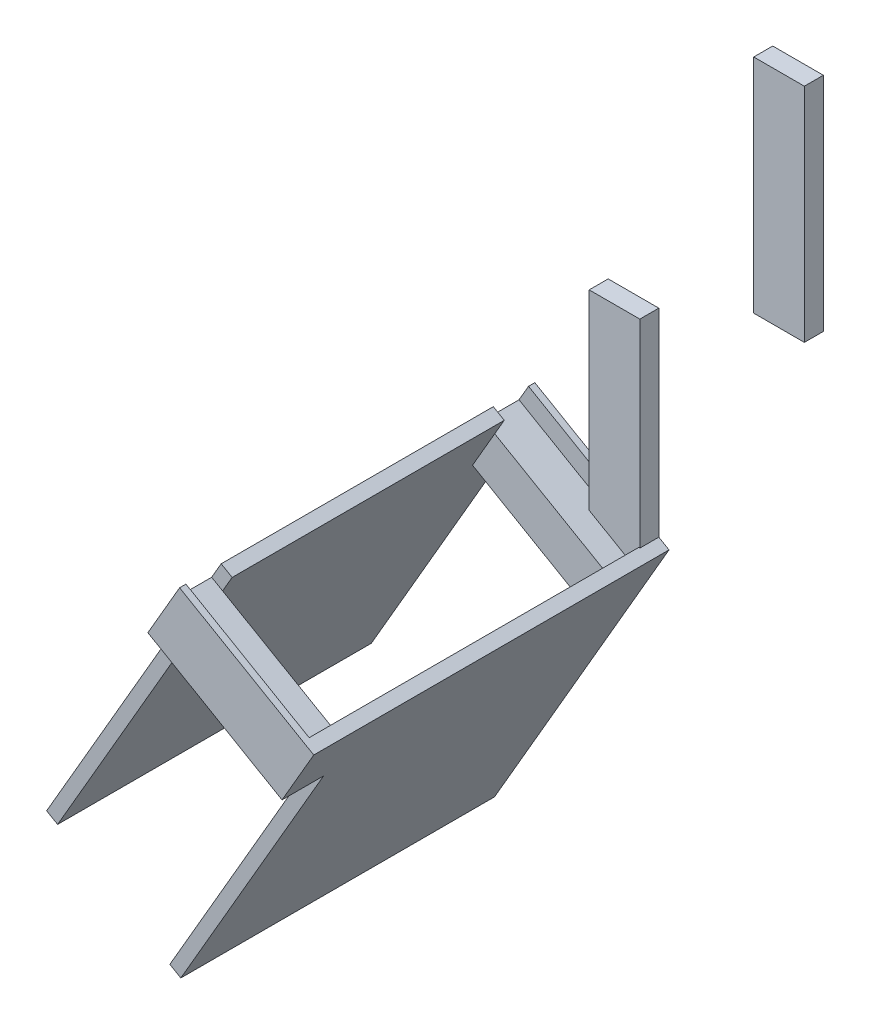
ISO-10303-21;
HEADER;
FILE_DESCRIPTION(('STEP AP214'),'2;1');
FILE_NAME('part.step','',(''),(''),'','','');
FILE_SCHEMA(('AUTOMOTIVE_DESIGN { 1 0 10303 214 1 1 1 1 }'));
ENDSEC;
DATA;
#1=APPLICATION_CONTEXT('core data for automotive mechanical design processes');
#2=APPLICATION_PROTOCOL_DEFINITION('international standard','automotive_design',2000,#1);
#3=PRODUCT_CONTEXT('',#1,'mechanical');
#4=PRODUCT('Part','Part','',(#3));
#5=PRODUCT_RELATED_PRODUCT_CATEGORY('part','',(#4));
#6=PRODUCT_DEFINITION_FORMATION('','',#4);
#7=PRODUCT_DEFINITION_CONTEXT('part definition',#1,'design');
#8=PRODUCT_DEFINITION('design','',#6,#7);
#9=PRODUCT_DEFINITION_SHAPE('','',#8);
#10=(LENGTH_UNIT() NAMED_UNIT(*) SI_UNIT(.MILLI.,.METRE.));
#11=(NAMED_UNIT(*) PLANE_ANGLE_UNIT() SI_UNIT($,.RADIAN.));
#12=(NAMED_UNIT(*) SI_UNIT($,.STERADIAN.) SOLID_ANGLE_UNIT());
#13=UNCERTAINTY_MEASURE_WITH_UNIT(LENGTH_MEASURE(1.E-05),#10,'distance_accuracy_value','');
#14=(GEOMETRIC_REPRESENTATION_CONTEXT(3) GLOBAL_UNCERTAINTY_ASSIGNED_CONTEXT((#13)) GLOBAL_UNIT_ASSIGNED_CONTEXT((#10,
#11,#12)) REPRESENTATION_CONTEXT('',''));
#15=CARTESIAN_POINT('',(0.,0.,0.));
#16=DIRECTION('',(0.,0.,1.));
#17=DIRECTION('',(1.,0.,0.));
#18=AXIS2_PLACEMENT_3D('',#15,#16,#17);
#19=CARTESIAN_POINT('',(34.9862978245216,35.9440867368321,-25.0667994456962));
#20=DIRECTION('',(1.,0.,0.));
#21=DIRECTION('',(0.,0.,-1.));
#22=AXIS2_PLACEMENT_3D('',#19,#20,#21);
#23=PLANE('',#22);
#24=DIRECTION('',(0.,-1.,0.));
#25=VECTOR('',#24,1.);
#26=CARTESIAN_POINT('',(34.9862978245216,35.9440867368321,-28.0667994456962));
#27=LINE('',#26,#25);
#28=CARTESIAN_POINT('',(34.9862978245216,71.0042807635458,-28.0667994456962));
#29=VERTEX_POINT('',#28);
#30=CARTESIAN_POINT('',(34.9862978245216,35.9440867368321,-28.0667994456962));
#31=VERTEX_POINT('',#30);
#32=EDGE_CURVE('E117',#29,#31,#27,.T.);
#33=ORIENTED_EDGE('',*,*,#32,.F.);
#34=DIRECTION('',(0.,0.,-1.));
#35=VECTOR('',#34,1.);
#36=CARTESIAN_POINT('',(34.9862978245216,71.0042807635458,-25.0667994456962));
#37=LINE('',#36,#35);
#38=CARTESIAN_POINT('',(34.9862978245216,71.0042807635458,-25.0667994456962));
#39=VERTEX_POINT('',#38);
#40=EDGE_CURVE('E12',#39,#29,#37,.T.);
#41=ORIENTED_EDGE('',*,*,#40,.F.);
#42=DIRECTION('',(0.,-1.,0.));
#43=VECTOR('',#42,1.);
#44=CARTESIAN_POINT('',(34.9862978245216,35.9440867368321,-25.0667994456962));
#45=LINE('',#44,#43);
#46=CARTESIAN_POINT('',(34.9862978245216,35.9440867368321,-25.0667994456962));
#47=VERTEX_POINT('',#46);
#48=EDGE_CURVE('E111',#39,#47,#45,.T.);
#49=ORIENTED_EDGE('',*,*,#48,.T.);
#50=DIRECTION('',(0.,0.,-1.));
#51=VECTOR('',#50,1.);
#52=CARTESIAN_POINT('',(34.9862978245216,35.9440867368321,-25.0667994456962));
#53=LINE('',#52,#51);
#54=EDGE_CURVE('E56',#47,#31,#53,.T.);
#55=ORIENTED_EDGE('',*,*,#54,.T.);
#56=EDGE_LOOP('',(#33,#41,#49,#55));
#57=FACE_BOUND('',#56,.T.);
#58=ADVANCED_FACE('F53',(#57),#23,.T.);
#59=CARTESIAN_POINT('',(34.9862978245216,71.0042807635458,-25.0667994456962));
#60=DIRECTION('',(0.,1.,0.));
#61=DIRECTION('',(-1.,0.,0.));
#62=AXIS2_PLACEMENT_3D('',#59,#60,#61);
#63=PLANE('',#62);
#64=DIRECTION('',(1.,0.,0.));
#65=VECTOR('',#64,1.);
#66=CARTESIAN_POINT('',(34.9862978245216,71.0042807635458,-28.0667994456962));
#67=LINE('',#66,#65);
#68=CARTESIAN_POINT('',(26.9862978245216,71.004280763546,-28.0667994456962));
#69=VERTEX_POINT('',#68);
#70=EDGE_CURVE('E113',#69,#29,#67,.T.);
#71=ORIENTED_EDGE('',*,*,#70,.F.);
#72=DIRECTION('',(0.,0.,-1.));
#73=VECTOR('',#72,1.);
#74=CARTESIAN_POINT('',(26.9862978245216,71.004280763546,-25.0667994456962));
#75=LINE('',#74,#73);
#76=CARTESIAN_POINT('',(26.9862978245216,71.004280763546,-25.0667994456962));
#77=VERTEX_POINT('',#76);
#78=EDGE_CURVE('E62',#77,#69,#75,.T.);
#79=ORIENTED_EDGE('',*,*,#78,.F.);
#80=DIRECTION('',(1.,0.,0.));
#81=VECTOR('',#80,1.);
#82=CARTESIAN_POINT('',(34.9862978245216,71.0042807635458,-25.0667994456962));
#83=LINE('',#82,#81);
#84=EDGE_CURVE('E108',#77,#39,#83,.T.);
#85=ORIENTED_EDGE('',*,*,#84,.T.);
#86=ORIENTED_EDGE('',*,*,#40,.T.);
#87=EDGE_LOOP('',(#71,#79,#85,#86));
#88=FACE_BOUND('',#87,.T.);
#89=ADVANCED_FACE('F127',(#88),#63,.T.);
#90=CARTESIAN_POINT('',(26.9862978245216,35.9440867368321,-25.0667994456962));
#91=DIRECTION('',(-1.,0.,0.));
#92=DIRECTION('',(0.,0.,1.));
#93=AXIS2_PLACEMENT_3D('',#90,#91,#92);
#94=PLANE('',#93);
#95=DIRECTION('',(0.,1.,0.));
#96=VECTOR('',#95,1.);
#97=CARTESIAN_POINT('',(26.9862978245216,35.9440867368321,-28.0667994456962));
#98=LINE('',#97,#96);
#99=CARTESIAN_POINT('',(26.9862978245216,35.9440867368321,-28.0667994456962));
#100=VERTEX_POINT('',#99);
#101=EDGE_CURVE('E103',#100,#69,#98,.T.);
#102=ORIENTED_EDGE('',*,*,#101,.F.);
#103=DIRECTION('',(0.,0.,-1.));
#104=VECTOR('',#103,1.);
#105=CARTESIAN_POINT('',(26.9862978245216,35.9440867368321,-25.0667994456962));
#106=LINE('',#105,#104);
#107=CARTESIAN_POINT('',(26.9862978245216,35.9440867368321,-25.0667994456962));
#108=VERTEX_POINT('',#107);
#109=EDGE_CURVE('E98',#108,#100,#106,.T.);
#110=ORIENTED_EDGE('',*,*,#109,.F.);
#111=DIRECTION('',(0.,1.,0.));
#112=VECTOR('',#111,1.);
#113=CARTESIAN_POINT('',(26.9862978245216,35.9440867368321,-25.0667994456962));
#114=LINE('',#113,#112);
#115=EDGE_CURVE('E101',#108,#77,#114,.T.);
#116=ORIENTED_EDGE('',*,*,#115,.T.);
#117=ORIENTED_EDGE('',*,*,#78,.T.);
#118=EDGE_LOOP('',(#102,#110,#116,#117));
#119=FACE_BOUND('',#118,.T.);
#120=ADVANCED_FACE('F100',(#119),#94,.T.);
#121=CARTESIAN_POINT('',(34.9862978245216,35.9440867368321,-25.0667994456962));
#122=DIRECTION('',(0.,-1.,0.));
#123=DIRECTION('',(0.,0.,-1.));
#124=AXIS2_PLACEMENT_3D('',#121,#122,#123);
#125=PLANE('',#124);
#126=DIRECTION('',(-1.,0.,0.));
#127=VECTOR('',#126,1.);
#128=CARTESIAN_POINT('',(34.9862978245216,35.9440867368321,-28.0667994456962));
#129=LINE('',#128,#127);
#130=EDGE_CURVE('E120',#31,#100,#129,.T.);
#131=ORIENTED_EDGE('',*,*,#130,.F.);
#132=ORIENTED_EDGE('',*,*,#54,.F.);
#133=DIRECTION('',(-1.,0.,0.));
#134=VECTOR('',#133,1.);
#135=CARTESIAN_POINT('',(34.9862978245216,35.9440867368321,-25.0667994456962));
#136=LINE('',#135,#134);
#137=EDGE_CURVE('E107',#47,#108,#136,.T.);
#138=ORIENTED_EDGE('',*,*,#137,.T.);
#139=ORIENTED_EDGE('',*,*,#109,.T.);
#140=EDGE_LOOP('',(#131,#132,#138,#139));
#141=FACE_BOUND('',#140,.T.);
#142=ADVANCED_FACE('F110',(#141),#125,.T.);
#143=CARTESIAN_POINT('',(0.,0.,-25.0667994456962));
#144=DIRECTION('',(0.,0.,1.));
#145=DIRECTION('',(1.,0.,0.));
#146=AXIS2_PLACEMENT_3D('',#143,#144,#145);
#147=PLANE('',#146);
#148=ORIENTED_EDGE('',*,*,#48,.F.);
#149=ORIENTED_EDGE('',*,*,#84,.F.);
#150=ORIENTED_EDGE('',*,*,#115,.F.);
#151=ORIENTED_EDGE('',*,*,#137,.F.);
#152=EDGE_LOOP('',(#148,#149,#150,#151));
#153=FACE_BOUND('',#152,.T.);
#154=ADVANCED_FACE('F106',(#153),#147,.T.);
#155=CARTESIAN_POINT('',(0.,0.,-28.0667994456962));
#156=DIRECTION('',(0.,0.,1.));
#157=DIRECTION('',(1.,0.,0.));
#158=AXIS2_PLACEMENT_3D('',#155,#156,#157);
#159=PLANE('',#158);
#160=ORIENTED_EDGE('',*,*,#32,.T.);
#161=ORIENTED_EDGE('',*,*,#130,.T.);
#162=ORIENTED_EDGE('',*,*,#101,.T.);
#163=ORIENTED_EDGE('',*,*,#70,.T.);
#164=EDGE_LOOP('',(#160,#161,#162,#163));
#165=FACE_BOUND('',#164,.T.);
#166=ADVANCED_FACE('F126',(#165),#159,.F.);
#167=CLOSED_SHELL('',(#58,#89,#120,#142,#154,#166));
#168=MANIFOLD_SOLID_BREP('B2',#167);
#169=CARTESIAN_POINT('',(0.,0.,0.));
#170=DIRECTION('',(-0.501370217547876,-0.865232861694467,0.));
#171=DIRECTION('',(0.865232861694467,-0.501370217547876,0.));
#172=AXIS2_PLACEMENT_3D('',#169,#170,#171);
#173=PLANE('',#172);
#174=DIRECTION('',(-0.865232861694466,0.501370217547877,0.));
#175=VECTOR('',#174,1.);
#176=CARTESIAN_POINT('',(8.86863683236822,-5.13904472986565,-27.0667994456962));
#177=LINE('',#176,#175);
#178=CARTESIAN_POINT('',(0.986297824521309,-0.57152285441259,-27.0667994456962));
#179=VERTEX_POINT('',#178);
#180=CARTESIAN_POINT('',(-10.5991025557571,6.14178516496151,-27.0667994456962));
#181=VERTEX_POINT('',#180);
#182=EDGE_CURVE('E408',#179,#181,#177,.T.);
#183=ORIENTED_EDGE('',*,*,#182,.F.);
#184=DIRECTION('',(0.,0.,-1.));
#185=VECTOR('',#184,1.);
#186=CARTESIAN_POINT('',(0.986297824521309,-0.571522854412649,0.));
#187=LINE('',#186,#185);
#188=CARTESIAN_POINT('',(0.986297824521309,-0.571522854412743,-28.0667994456962));
#189=VERTEX_POINT('',#188);
#190=EDGE_CURVE('E397',#179,#189,#187,.T.);
#191=ORIENTED_EDGE('',*,*,#190,.T.);
#192=DIRECTION('',(0.865232861694466,-0.501370217547876,0.));
#193=VECTOR('',#192,1.);
#194=CARTESIAN_POINT('',(10.5991025557572,-6.14178516496157,-28.0667994456962));
#195=LINE('',#194,#193);
#196=CARTESIAN_POINT('',(-10.5991025557572,6.14178516496138,-28.0667994456962));
#197=VERTEX_POINT('',#196);
#198=EDGE_CURVE('E557',#197,#189,#195,.T.);
#199=ORIENTED_EDGE('',*,*,#198,.F.);
#200=DIRECTION('',(0.,0.,-1.));
#201=VECTOR('',#200,1.);
#202=CARTESIAN_POINT('',(-10.5991025557572,6.14178516496138,-28.0667994456962));
#203=LINE('',#202,#201);
#204=EDGE_CURVE('E574',#181,#197,#203,.T.);
#205=ORIENTED_EDGE('',*,*,#204,.F.);
#206=EDGE_LOOP('',(#183,#191,#199,#205));
#207=FACE_BOUND('',#206,.T.);
#208=ADVANCED_FACE('F177',(#207),#173,.F.);
#209=DIRECTION('',(0.,0.,-1.));
#210=VECTOR('',#209,1.);
#211=CARTESIAN_POINT('',(-8.86863683236836,5.1390447298657,-21.5000000000001));
#212=LINE('',#211,#210);
#213=CARTESIAN_POINT('',(-8.86863683236849,5.13904472986582,21.5000000000001));
#214=VERTEX_POINT('',#213);
#215=CARTESIAN_POINT('',(-8.86863683236827,5.13904472986578,-21.5000000000001));
#216=VERTEX_POINT('',#215);
#217=EDGE_CURVE('E520',#214,#216,#212,.T.);
#218=ORIENTED_EDGE('',*,*,#217,.T.);
#219=DIRECTION('',(0.865232861694466,-0.501370217547877,0.));
#220=VECTOR('',#219,1.);
#221=CARTESIAN_POINT('',(8.8686368323682,-5.13904472986565,-21.5000000000001));
#222=LINE('',#221,#220);
#223=CARTESIAN_POINT('',(-10.5991025557571,6.1417851649615,-21.5000000000001));
#224=VERTEX_POINT('',#223);
#225=EDGE_CURVE('E415',#224,#216,#222,.T.);
#226=ORIENTED_EDGE('',*,*,#225,.F.);
#227=CARTESIAN_POINT('',(-10.5991025557572,6.14178516496144,21.5000000000001));
#228=VERTEX_POINT('',#227);
#229=EDGE_CURVE('E580',#228,#224,#203,.T.);
#230=ORIENTED_EDGE('',*,*,#229,.F.);
#231=DIRECTION('',(-0.865232861694466,0.501370217547877,0.));
#232=VECTOR('',#231,1.);
#233=CARTESIAN_POINT('',(-848.703286351533,491.791944284619,21.4999999999992));
#234=LINE('',#233,#232);
#235=EDGE_CURVE('E425',#214,#228,#234,.T.);
#236=ORIENTED_EDGE('',*,*,#235,.F.);
#237=EDGE_LOOP('',(#218,#226,#230,#236));
#238=FACE_BOUND('',#237,.T.);
#239=ADVANCED_FACE('F655',(#238),#173,.F.);
#240=CARTESIAN_POINT('',(-13.8823390078471,-3.51328388707882,21.4999999999999));
#241=DIRECTION('',(0.,0.,-1.));
#242=DIRECTION('',(-1.,0.,0.));
#243=AXIS2_PLACEMENT_3D('',#240,#241,#242);
#244=PLANE('',#243);
#245=DIRECTION('',(0.501370217547876,0.865232861694466,0.));
#246=VECTOR('',#245,1.);
#247=CARTESIAN_POINT('',(-13.8823390078471,-3.51328388707882,21.4999999999999));
#248=LINE('',#247,#246);
#249=CARTESIAN_POINT('',(-13.8823390078472,-3.51328388707891,21.4999999999999));
#250=VERTEX_POINT('',#249);
#251=CARTESIAN_POINT('',(-10.372747485012,2.54334614478235,21.5000000000001));
#252=VERTEX_POINT('',#251);
#253=EDGE_CURVE('E536',#250,#252,#248,.T.);
#254=ORIENTED_EDGE('',*,*,#253,.T.);
#255=DIRECTION('',(-0.865232861694466,0.501370217547877,0.));
#256=VECTOR('',#255,1.);
#257=CARTESIAN_POINT('',(-850.207397004177,489.196245699535,21.4999999999992));
#258=LINE('',#257,#256);
#259=CARTESIAN_POINT('',(7.36452617972448,-7.73474331494909,21.5000000000001));
#260=VERTEX_POINT('',#259);
#261=EDGE_CURVE('E432',#260,#252,#258,.T.);
#262=ORIENTED_EDGE('',*,*,#261,.F.);
#263=DIRECTION('',(0.501370217547876,0.865232861694466,0.));
#264=VECTOR('',#263,1.);
#265=CARTESIAN_POINT('',(3.85493465688941,-13.7913733468103,21.5000000000001));
#266=LINE('',#265,#264);
#267=CARTESIAN_POINT('',(3.8549346568894,-13.7913733468103,21.5000000000001));
#268=VERTEX_POINT('',#267);
#269=EDGE_CURVE('E540',#268,#260,#266,.T.);
#270=ORIENTED_EDGE('',*,*,#269,.F.);
#271=DIRECTION('',(-0.865232861694467,0.501370217547876,0.));
#272=VECTOR('',#271,1.);
#273=CARTESIAN_POINT('',(-13.8823390078471,-3.51328388707882,21.4999999999999));
#274=LINE('',#273,#272);
#275=EDGE_CURVE('E525',#268,#250,#274,.T.);
#276=ORIENTED_EDGE('',*,*,#275,.T.);
#277=EDGE_LOOP('',(#254,#262,#270,#276));
#278=FACE_BOUND('',#277,.T.);
#279=ADVANCED_FACE('F682',(#278),#244,.T.);
#280=CARTESIAN_POINT('',(-5.01370217547876,-8.65232861694467,0.));
#281=DIRECTION('',(-0.501370217547876,-0.865232861694467,0.));
#282=DIRECTION('',(0.865232861694467,-0.501370217547876,0.));
#283=AXIS2_PLACEMENT_3D('',#280,#281,#282);
#284=PLANE('',#283);
#285=DIRECTION('',(0.865232861694467,-0.501370217547876,0.));
#286=VECTOR('',#285,1.);
#287=CARTESIAN_POINT('',(-13.8823390078471,-3.51328388707896,-21.5000000000001));
#288=LINE('',#287,#286);
#289=CARTESIAN_POINT('',(-13.8823390078471,-3.51328388707896,-21.5000000000001));
#290=VERTEX_POINT('',#289);
#291=CARTESIAN_POINT('',(3.85493465688943,-13.7913733468103,-21.5));
#292=VERTEX_POINT('',#291);
#293=EDGE_CURVE('E521',#290,#292,#288,.T.);
#294=ORIENTED_EDGE('',*,*,#293,.F.);
#295=DIRECTION('',(0.,0.,1.));
#296=VECTOR('',#295,1.);
#297=CARTESIAN_POINT('',(-13.8823390078471,-3.51328388707885,-28.0667994456962));
#298=LINE('',#297,#296);
#299=CARTESIAN_POINT('',(-13.8823390078471,-3.51328388707885,-28.0667994456962));
#300=VERTEX_POINT('',#299);
#301=EDGE_CURVE('E472',#300,#290,#298,.T.);
#302=ORIENTED_EDGE('',*,*,#301,.F.);
#303=DIRECTION('',(0.865232861694466,-0.501370217547876,0.));
#304=VECTOR('',#303,1.);
#305=CARTESIAN_POINT('',(5.58540038027846,-14.7941137819062,-28.0667994456962));
#306=LINE('',#305,#304);
#307=CARTESIAN_POINT('',(3.85493465688944,-13.7913733468103,-28.0667994456962));
#308=VERTEX_POINT('',#307);
#309=EDGE_CURVE('E564',#300,#308,#306,.T.);
#310=ORIENTED_EDGE('',*,*,#309,.T.);
#311=DIRECTION('',(0.,0.,-1.));
#312=VECTOR('',#311,1.);
#313=CARTESIAN_POINT('',(3.85493465688937,-13.7913733468104,21.5000000000001));
#314=LINE('',#313,#312);
#315=EDGE_CURVE('E494',#292,#308,#314,.T.);
#316=ORIENTED_EDGE('',*,*,#315,.F.);
#317=EDGE_LOOP('',(#294,#302,#310,#316));
#318=FACE_BOUND('',#317,.T.);
#319=ADVANCED_FACE('F670',(#318),#284,.T.);
#320=DIRECTION('',(0.,0.,-1.));
#321=VECTOR('',#320,1.);
#322=CARTESIAN_POINT('',(-15.612804731236,-2.51054345198328,-28.0667994456962));
#323=LINE('',#322,#321);
#324=CARTESIAN_POINT('',(-15.612804731236,-2.51054345198309,28.0667994456962));
#325=VERTEX_POINT('',#324);
#326=CARTESIAN_POINT('',(-15.612804731236,-2.51054345198321,21.4999999999999));
#327=VERTEX_POINT('',#326);
#328=EDGE_CURVE('E560',#325,#327,#323,.T.);
#329=ORIENTED_EDGE('',*,*,#328,.T.);
#330=DIRECTION('',(-0.865232861694466,0.501370217547877,0.));
#331=VECTOR('',#330,1.);
#332=CARTESIAN_POINT('',(-15.612804731236,-2.51054345198321,21.4999999999999));
#333=LINE('',#332,#331);
#334=EDGE_CURVE('E469',#250,#327,#333,.T.);
#335=ORIENTED_EDGE('',*,*,#334,.F.);
#336=ORIENTED_EDGE('',*,*,#275,.F.);
#337=DIRECTION('',(-0.865232861694465,0.501370217547877,0.));
#338=VECTOR('',#337,1.);
#339=CARTESIAN_POINT('',(3.85493465688937,-13.7913733468104,21.5000000000001));
#340=LINE('',#339,#338);
#341=CARTESIAN_POINT('',(5.5854003802784,-14.7941137819062,21.5000000000001));
#342=VERTEX_POINT('',#341);
#343=EDGE_CURVE('E476',#342,#268,#340,.T.);
#344=ORIENTED_EDGE('',*,*,#343,.F.);
#345=DIRECTION('',(0.,0.,1.));
#346=VECTOR('',#345,1.);
#347=CARTESIAN_POINT('',(5.58540038027846,-14.7941137819062,-28.0667994456962));
#348=LINE('',#347,#346);
#349=CARTESIAN_POINT('',(5.58540038027846,-14.794113781906,28.0667994456963));
#350=VERTEX_POINT('',#349);
#351=EDGE_CURVE('E553',#342,#350,#348,.T.);
#352=ORIENTED_EDGE('',*,*,#351,.T.);
#353=DIRECTION('',(-0.865232861694467,0.501370217547876,0.));
#354=VECTOR('',#353,1.);
#355=CARTESIAN_POINT('',(5.58540038027846,-14.794113781906,28.0667994456963));
#356=LINE('',#355,#354);
#357=EDGE_CURVE('E556',#350,#325,#356,.T.);
#358=ORIENTED_EDGE('',*,*,#357,.T.);
#359=EDGE_LOOP('',(#329,#335,#336,#344,#352,#358));
#360=FACE_BOUND('',#359,.T.);
#361=ADVANCED_FACE('F687',(#360),#284,.T.);
#362=CARTESIAN_POINT('',(8.98629782452132,-5.20722489250682,-28.0667994456962));
#363=VERTEX_POINT('',#362);
#364=CARTESIAN_POINT('',(10.5991025557572,-6.14178516496157,-28.0667994456962));
#365=VERTEX_POINT('',#364);
#366=EDGE_CURVE('E579',#363,#365,#195,.T.);
#367=ORIENTED_EDGE('',*,*,#366,.F.);
#368=DIRECTION('',(0.,0.,1.));
#369=VECTOR('',#368,1.);
#370=CARTESIAN_POINT('',(8.98629782452132,-5.20722489250673,0.));
#371=LINE('',#370,#369);
#372=CARTESIAN_POINT('',(8.98629782452132,-5.20722489250681,-25.0667994456962));
#373=VERTEX_POINT('',#372);
#374=EDGE_CURVE('E364',#363,#373,#371,.T.);
#375=ORIENTED_EDGE('',*,*,#374,.T.);
#376=DIRECTION('',(-0.865232861694467,0.501370217547876,0.));
#377=VECTOR('',#376,1.);
#378=CARTESIAN_POINT('',(0.,0.,-25.0667994456962));
#379=LINE('',#378,#377);
#380=CARTESIAN_POINT('',(8.86863683236823,-5.13904472986565,-25.0667994456962));
#381=VERTEX_POINT('',#380);
#382=EDGE_CURVE('E389',#373,#381,#379,.T.);
#383=ORIENTED_EDGE('',*,*,#382,.T.);
#384=DIRECTION('',(0.,0.,1.));
#385=VECTOR('',#384,1.);
#386=CARTESIAN_POINT('',(8.86863683236817,-5.13904472986573,-21.5000000000001));
#387=LINE('',#386,#385);
#388=CARTESIAN_POINT('',(8.86863683236814,-5.13904472986572,27.0667994456963));
#389=VERTEX_POINT('',#388);
#390=EDGE_CURVE('E526',#381,#389,#387,.T.);
#391=ORIENTED_EDGE('',*,*,#390,.T.);
#392=DIRECTION('',(0.865232861694466,-0.501370217547877,0.));
#393=VECTOR('',#392,1.);
#394=CARTESIAN_POINT('',(-848.703286351533,491.791944284619,27.0667994456954));
#395=LINE('',#394,#393);
#396=CARTESIAN_POINT('',(-10.5991025557574,6.1417851649615,27.0667994456962));
#397=VERTEX_POINT('',#396);
#398=EDGE_CURVE('E418',#397,#389,#395,.T.);
#399=ORIENTED_EDGE('',*,*,#398,.F.);
#400=CARTESIAN_POINT('',(-10.5991025557572,6.14178516496157,28.0667994456962));
#401=VERTEX_POINT('',#400);
#402=EDGE_CURVE('E575',#401,#397,#203,.T.);
#403=ORIENTED_EDGE('',*,*,#402,.F.);
#404=DIRECTION('',(-0.865232861694467,0.501370217547876,0.));
#405=VECTOR('',#404,1.);
#406=CARTESIAN_POINT('',(10.5991025557572,-6.14178516496138,28.0667994456962));
#407=LINE('',#406,#405);
#408=CARTESIAN_POINT('',(10.5991025557572,-6.14178516496138,28.0667994456962));
#409=VERTEX_POINT('',#408);
#410=EDGE_CURVE('E571',#409,#401,#407,.T.);
#411=ORIENTED_EDGE('',*,*,#410,.F.);
#412=DIRECTION('',(0.,0.,1.));
#413=VECTOR('',#412,1.);
#414=CARTESIAN_POINT('',(10.5991025557572,-6.14178516496157,-28.0667994456962));
#415=LINE('',#414,#413);
#416=EDGE_CURVE('E552',#365,#409,#415,.T.);
#417=ORIENTED_EDGE('',*,*,#416,.F.);
#418=EDGE_LOOP('',(#367,#375,#383,#391,#399,#403,#411,#417));
#419=FACE_BOUND('',#418,.T.);
#420=ADVANCED_FACE('F616',(#419),#173,.F.);
#421=CARTESIAN_POINT('',(5.58540038027846,-14.7941137819062,-28.0667994456962));
#422=DIRECTION('',(-0.865232861694466,0.501370217547876,0.));
#423=DIRECTION('',(-0.501370217547876,-0.865232861694466,0.));
#424=AXIS2_PLACEMENT_3D('',#421,#422,#423);
#425=PLANE('',#424);
#426=DIRECTION('',(0.501370217547876,0.865232861694466,0.));
#427=VECTOR('',#426,1.);
#428=CARTESIAN_POINT('',(5.58540038027846,-14.7941137819062,-28.0667994456962));
#429=LINE('',#428,#427);
#430=CARTESIAN_POINT('',(-16.9762594093759,-53.7295925581571,-28.0667994456963));
#431=VERTEX_POINT('',#430);
#432=EDGE_CURVE('E567',#431,#365,#429,.T.);
#433=ORIENTED_EDGE('',*,*,#432,.T.);
#434=ORIENTED_EDGE('',*,*,#416,.T.);
#435=DIRECTION('',(0.501370217547876,0.865232861694466,0.));
#436=VECTOR('',#435,1.);
#437=CARTESIAN_POINT('',(5.58540038027846,-14.794113781906,28.0667994456963));
#438=LINE('',#437,#436);
#439=EDGE_CURVE('E593',#350,#409,#438,.T.);
#440=ORIENTED_EDGE('',*,*,#439,.F.);
#441=ORIENTED_EDGE('',*,*,#351,.F.);
#442=DIRECTION('',(0.501370217547877,0.865232861694466,0.));
#443=VECTOR('',#442,1.);
#444=CARTESIAN_POINT('',(-16.9762594093761,-53.7295925581571,21.5));
#445=LINE('',#444,#443);
#446=CARTESIAN_POINT('',(-16.9762594093761,-53.7295925581571,21.5));
#447=VERTEX_POINT('',#446);
#448=EDGE_CURVE('E504',#447,#342,#445,.T.);
#449=ORIENTED_EDGE('',*,*,#448,.F.);
#450=DIRECTION('',(0.,0.,1.));
#451=VECTOR('',#450,1.);
#452=CARTESIAN_POINT('',(-16.9762594093761,-53.7295925581571,21.5));
#453=LINE('',#452,#451);
#454=EDGE_CURVE('E501',#431,#447,#453,.T.);
#455=ORIENTED_EDGE('',*,*,#454,.F.);
#456=EDGE_LOOP('',(#433,#434,#440,#441,#449,#455));
#457=FACE_BOUND('',#456,.T.);
#458=ADVANCED_FACE('F179',(#457),#425,.F.);
#459=CARTESIAN_POINT('',(5.58540038027846,-14.794113781906,28.0667994456963));
#460=DIRECTION('',(0.,0.,-1.));
#461=DIRECTION('',(0.,1.,0.));
#462=AXIS2_PLACEMENT_3D('',#459,#460,#461);
#463=PLANE('',#462);
#464=ORIENTED_EDGE('',*,*,#410,.T.);
#465=DIRECTION('',(0.501370217547876,0.865232861694466,0.));
#466=VECTOR('',#465,1.);
#467=CARTESIAN_POINT('',(-15.612804731236,-2.51054345198309,28.0667994456962));
#468=LINE('',#467,#466);
#469=EDGE_CURVE('E589',#325,#401,#468,.T.);
#470=ORIENTED_EDGE('',*,*,#469,.F.);
#471=ORIENTED_EDGE('',*,*,#357,.F.);
#472=ORIENTED_EDGE('',*,*,#439,.T.);
#473=EDGE_LOOP('',(#464,#470,#471,#472));
#474=FACE_BOUND('',#473,.T.);
#475=ADVANCED_FACE('F631',(#474),#463,.F.);
#476=CARTESIAN_POINT('',(-15.612804731236,-2.51054345198328,-28.0667994456962));
#477=DIRECTION('',(0.865232861694466,-0.501370217547876,0.));
#478=DIRECTION('',(0.501370217547876,0.865232861694466,0.));
#479=AXIS2_PLACEMENT_3D('',#476,#477,#478);
#480=PLANE('',#479);
#481=ORIENTED_EDGE('',*,*,#229,.T.);
#482=DIRECTION('',(-0.501370217547876,-0.865232861694466,0.));
#483=VECTOR('',#482,1.);
#484=CARTESIAN_POINT('',(-15.612804731236,-2.51054345198329,-21.5000000000001));
#485=LINE('',#484,#483);
#486=CARTESIAN_POINT('',(-12.1032132084008,3.5460865798781,-21.5000000000001));
#487=VERTEX_POINT('',#486);
#488=EDGE_CURVE('E454',#224,#487,#485,.T.);
#489=ORIENTED_EDGE('',*,*,#488,.T.);
#490=DIRECTION('',(0.,0.,-1.));
#491=VECTOR('',#490,1.);
#492=CARTESIAN_POINT('',(-12.1032132084008,3.54608657987807,-28.0667994456962));
#493=LINE('',#492,#491);
#494=CARTESIAN_POINT('',(-12.1032132084008,3.54608657987811,-27.0667994456963));
#495=VERTEX_POINT('',#494);
#496=EDGE_CURVE('E447',#487,#495,#493,.T.);
#497=ORIENTED_EDGE('',*,*,#496,.T.);
#498=DIRECTION('',(0.501370217547876,0.865232861694466,0.));
#499=VECTOR('',#498,1.);
#500=CARTESIAN_POINT('',(-15.612804731236,-2.51054345198328,-27.0667994456963));
#501=LINE('',#500,#499);
#502=EDGE_CURVE('E601',#495,#181,#501,.T.);
#503=ORIENTED_EDGE('',*,*,#502,.T.);
#504=ORIENTED_EDGE('',*,*,#204,.T.);
#505=DIRECTION('',(0.501370217547876,0.865232861694466,0.));
#506=VECTOR('',#505,1.);
#507=CARTESIAN_POINT('',(-15.612804731236,-2.51054345198328,-28.0667994456962));
#508=LINE('',#507,#506);
#509=CARTESIAN_POINT('',(-38.1744645208904,-41.4460222282341,-28.0667994456963));
#510=VERTEX_POINT('',#509);
#511=EDGE_CURVE('E585',#510,#197,#508,.T.);
#512=ORIENTED_EDGE('',*,*,#511,.F.);
#513=DIRECTION('',(0.,0.,-1.));
#514=VECTOR('',#513,1.);
#515=CARTESIAN_POINT('',(-38.1744645208904,-41.4460222282341,-28.0667994456963));
#516=LINE('',#515,#514);
#517=CARTESIAN_POINT('',(-38.1744645208904,-41.4460222282342,21.4999999999998));
#518=VERTEX_POINT('',#517);
#519=EDGE_CURVE('E468',#518,#510,#516,.T.);
#520=ORIENTED_EDGE('',*,*,#519,.F.);
#521=DIRECTION('',(0.501370217547877,0.865232861694466,0.));
#522=VECTOR('',#521,1.);
#523=CARTESIAN_POINT('',(-38.1744645208904,-41.4460222282342,21.4999999999998));
#524=LINE('',#523,#522);
#525=EDGE_CURVE('E464',#518,#327,#524,.T.);
#526=ORIENTED_EDGE('',*,*,#525,.T.);
#527=ORIENTED_EDGE('',*,*,#328,.F.);
#528=ORIENTED_EDGE('',*,*,#469,.T.);
#529=ORIENTED_EDGE('',*,*,#402,.T.);
#530=DIRECTION('',(-0.501370217547876,-0.865232861694466,0.));
#531=VECTOR('',#530,1.);
#532=CARTESIAN_POINT('',(-15.6128047312361,-2.51054345198333,27.0667994456962));
#533=LINE('',#532,#531);
#534=CARTESIAN_POINT('',(-12.103213208401,3.54608657987809,27.0667994456962));
#535=VERTEX_POINT('',#534);
#536=EDGE_CURVE('E597',#397,#535,#533,.T.);
#537=ORIENTED_EDGE('',*,*,#536,.T.);
#538=DIRECTION('',(0.,0.,1.));
#539=VECTOR('',#538,1.);
#540=CARTESIAN_POINT('',(-12.1032132084008,3.54608657987812,-28.0667994456962));
#541=LINE('',#540,#539);
#542=CARTESIAN_POINT('',(-12.1032132084009,3.54608657987804,21.5000000000001));
#543=VERTEX_POINT('',#542);
#544=EDGE_CURVE('E414',#543,#535,#541,.T.);
#545=ORIENTED_EDGE('',*,*,#544,.F.);
#546=DIRECTION('',(0.501370217547876,0.865232861694466,0.));
#547=VECTOR('',#546,1.);
#548=CARTESIAN_POINT('',(-15.6128047312361,-2.51054345198332,21.5));
#549=LINE('',#548,#547);
#550=EDGE_CURVE('E443',#543,#228,#549,.T.);
#551=ORIENTED_EDGE('',*,*,#550,.T.);
#552=EDGE_LOOP('',(#481,#489,#497,#503,#504,#512,#520,#526,#527,#528,#529,#537,#545,#551));
#553=FACE_BOUND('',#552,.T.);
#554=ADVANCED_FACE('F624',(#553),#480,.F.);
#555=CARTESIAN_POINT('',(5.58540038027846,-14.7941137819062,-28.0667994456962));
#556=DIRECTION('',(0.,0.,1.));
#557=DIRECTION('',(0.,-1.,0.));
#558=AXIS2_PLACEMENT_3D('',#555,#556,#557);
#559=PLANE('',#558);
#560=ORIENTED_EDGE('',*,*,#366,.T.);
#561=ORIENTED_EDGE('',*,*,#432,.F.);
#562=DIRECTION('',(0.865232861694466,-0.501370217547877,0.));
#563=VECTOR('',#562,1.);
#564=CARTESIAN_POINT('',(-18.706725132765,-52.7268521230613,-28.0667994456963));
#565=LINE('',#564,#563);
#566=CARTESIAN_POINT('',(-18.706725132765,-52.7268521230613,-28.0667994456963));
#567=VERTEX_POINT('',#566);
#568=EDGE_CURVE('E497',#567,#431,#565,.T.);
#569=ORIENTED_EDGE('',*,*,#568,.F.);
#570=DIRECTION('',(0.501370217547877,0.865232861694466,0.));
#571=VECTOR('',#570,1.);
#572=CARTESIAN_POINT('',(-18.706725132765,-52.7268521230613,-28.0667994456963));
#573=LINE('',#572,#571);
#574=EDGE_CURVE('E512',#567,#308,#573,.T.);
#575=ORIENTED_EDGE('',*,*,#574,.T.);
#576=ORIENTED_EDGE('',*,*,#309,.F.);
#577=DIRECTION('',(0.501370217547877,0.865232861694466,0.));
#578=VECTOR('',#577,1.);
#579=CARTESIAN_POINT('',(-36.4439987975015,-42.4487626633298,-28.0667994456963));
#580=LINE('',#579,#578);
#581=CARTESIAN_POINT('',(-36.4439987975015,-42.4487626633298,-28.0667994456963));
#582=VERTEX_POINT('',#581);
#583=EDGE_CURVE('E458',#582,#300,#580,.T.);
#584=ORIENTED_EDGE('',*,*,#583,.F.);
#585=DIRECTION('',(0.865232861694466,-0.501370217547877,0.));
#586=VECTOR('',#585,1.);
#587=CARTESIAN_POINT('',(-38.1744645208904,-41.4460222282341,-28.0667994456963));
#588=LINE('',#587,#586);
#589=EDGE_CURVE('E473',#510,#582,#588,.T.);
#590=ORIENTED_EDGE('',*,*,#589,.F.);
#591=ORIENTED_EDGE('',*,*,#511,.T.);
#592=ORIENTED_EDGE('',*,*,#198,.T.);
#593=DIRECTION('',(0.,1.,0.));
#594=VECTOR('',#593,1.);
#595=CARTESIAN_POINT('',(0.986297824521309,26.1351329428382,-28.0667994456962));
#596=LINE('',#595,#594);
#597=CARTESIAN_POINT('',(0.986297824521309,26.1351329428382,-28.0667994456962));
#598=VERTEX_POINT('',#597);
#599=EDGE_CURVE('E372',#189,#598,#596,.T.);
#600=ORIENTED_EDGE('',*,*,#599,.T.);
#601=DIRECTION('',(1.,0.,0.));
#602=VECTOR('',#601,1.);
#603=CARTESIAN_POINT('',(0.986297824521309,26.1351329428382,-28.0667994456962));
#604=LINE('',#603,#602);
#605=CARTESIAN_POINT('',(8.98629782452132,26.1351329428381,-28.0667994456962));
#606=VERTEX_POINT('',#605);
#607=EDGE_CURVE('E352',#598,#606,#604,.T.);
#608=ORIENTED_EDGE('',*,*,#607,.T.);
#609=DIRECTION('',(0.,-1.,0.));
#610=VECTOR('',#609,1.);
#611=CARTESIAN_POINT('',(8.98629782452132,26.1351329428381,-28.0667994456962));
#612=LINE('',#611,#610);
#613=EDGE_CURVE('E361',#606,#363,#612,.T.);
#614=ORIENTED_EDGE('',*,*,#613,.T.);
#615=EDGE_LOOP('',(#560,#561,#569,#575,#576,#584,#590,#591,#592,#600,#608,#614));
#616=FACE_BOUND('',#615,.T.);
#617=ADVANCED_FACE('F370',(#616),#559,.F.);
#618=CARTESIAN_POINT('',(-13.8823390078471,-3.51328388707896,-21.5000000000001));
#619=DIRECTION('',(0.865232861694466,-0.501370217547876,0.));
#620=DIRECTION('',(0.501370217547876,0.865232861694466,0.));
#621=AXIS2_PLACEMENT_3D('',#618,#619,#620);
#622=PLANE('',#621);
#623=ORIENTED_EDGE('',*,*,#217,.F.);
#624=EDGE_CURVE('E530',#252,#214,#248,.T.);
#625=ORIENTED_EDGE('',*,*,#624,.F.);
#626=ORIENTED_EDGE('',*,*,#253,.F.);
#627=DIRECTION('',(0.501370217547877,0.865232861694466,0.));
#628=VECTOR('',#627,1.);
#629=CARTESIAN_POINT('',(-36.4439987975016,-42.4487626633299,21.4999999999998));
#630=LINE('',#629,#628);
#631=CARTESIAN_POINT('',(-36.4439987975016,-42.4487626633299,21.4999999999998));
#632=VERTEX_POINT('',#631);
#633=EDGE_CURVE('E461',#632,#250,#630,.T.);
#634=ORIENTED_EDGE('',*,*,#633,.F.);
#635=DIRECTION('',(0.,0.,1.));
#636=VECTOR('',#635,1.);
#637=CARTESIAN_POINT('',(-36.4439987975015,-42.4487626633298,-28.0667994456963));
#638=LINE('',#637,#636);
#639=EDGE_CURVE('E483',#582,#632,#638,.T.);
#640=ORIENTED_EDGE('',*,*,#639,.F.);
#641=ORIENTED_EDGE('',*,*,#583,.T.);
#642=ORIENTED_EDGE('',*,*,#301,.T.);
#643=DIRECTION('',(0.501370217547876,0.865232861694466,0.));
#644=VECTOR('',#643,1.);
#645=CARTESIAN_POINT('',(-13.8823390078471,-3.51328388707896,-21.5000000000001));
#646=LINE('',#645,#644);
#647=CARTESIAN_POINT('',(-10.3727474850119,2.5433461447824,-21.5000000000001));
#648=VERTEX_POINT('',#647);
#649=EDGE_CURVE('E548',#290,#648,#646,.T.);
#650=ORIENTED_EDGE('',*,*,#649,.T.);
#651=DIRECTION('',(-0.501370217547876,-0.865232861694466,0.));
#652=VECTOR('',#651,1.);
#653=CARTESIAN_POINT('',(-13.8823390078471,-3.51328388707896,-21.5000000000001));
#654=LINE('',#653,#652);
#655=EDGE_CURVE('E451',#216,#648,#654,.T.);
#656=ORIENTED_EDGE('',*,*,#655,.F.);
#657=EDGE_LOOP('',(#623,#625,#626,#634,#640,#641,#642,#650,#656));
#658=FACE_BOUND('',#657,.T.);
#659=ADVANCED_FACE('F662',(#658),#622,.T.);
#660=CARTESIAN_POINT('',(-13.8823390078471,-3.51328388707896,-21.5000000000001));
#661=DIRECTION('',(0.,0.,1.));
#662=DIRECTION('',(0.,-1.,0.));
#663=AXIS2_PLACEMENT_3D('',#660,#661,#662);
#664=PLANE('',#663);
#665=DIRECTION('',(0.865232861694466,-0.501370217547877,0.));
#666=VECTOR('',#665,1.);
#667=CARTESIAN_POINT('',(7.36452617972457,-7.73474331494904,-21.5000000000001));
#668=LINE('',#667,#666);
#669=CARTESIAN_POINT('',(7.36452617972455,-7.73474331494912,-21.5));
#670=VERTEX_POINT('',#669);
#671=EDGE_CURVE('E404',#648,#670,#668,.T.);
#672=ORIENTED_EDGE('',*,*,#671,.F.);
#673=ORIENTED_EDGE('',*,*,#649,.F.);
#674=ORIENTED_EDGE('',*,*,#293,.T.);
#675=DIRECTION('',(0.501370217547876,0.865232861694466,0.));
#676=VECTOR('',#675,1.);
#677=CARTESIAN_POINT('',(3.85493465688941,-13.7913733468104,-21.5));
#678=LINE('',#677,#676);
#679=EDGE_CURVE('E544',#292,#670,#678,.T.);
#680=ORIENTED_EDGE('',*,*,#679,.T.);
#681=EDGE_LOOP('',(#672,#673,#674,#680));
#682=FACE_BOUND('',#681,.T.);
#683=ADVANCED_FACE('F668',(#682),#664,.T.);
#684=CARTESIAN_POINT('',(3.85493465688941,-13.7913733468104,-21.5));
#685=DIRECTION('',(-0.865232861694466,0.501370217547876,0.));
#686=DIRECTION('',(-0.501370217547876,-0.865232861694466,0.));
#687=AXIS2_PLACEMENT_3D('',#684,#685,#686);
#688=PLANE('',#687);
#689=DIRECTION('',(0.501370217547876,0.865232861694466,0.));
#690=VECTOR('',#689,1.);
#691=CARTESIAN_POINT('',(3.85493465688942,-13.7913733468104,-25.0667994456962));
#692=LINE('',#691,#690);
#693=CARTESIAN_POINT('',(7.36452617972459,-7.73474331494913,-25.0667994456962));
#694=VERTEX_POINT('',#693);
#695=EDGE_CURVE('E377',#694,#381,#692,.T.);
#696=ORIENTED_EDGE('',*,*,#695,.F.);
#697=DIRECTION('',(0.,0.,-1.));
#698=VECTOR('',#697,1.);
#699=CARTESIAN_POINT('',(7.36452617972457,-7.73474331494904,-21.5000000000001));
#700=LINE('',#699,#698);
#701=EDGE_CURVE('E201',#670,#694,#700,.T.);
#702=ORIENTED_EDGE('',*,*,#701,.F.);
#703=ORIENTED_EDGE('',*,*,#679,.F.);
#704=ORIENTED_EDGE('',*,*,#315,.T.);
#705=ORIENTED_EDGE('',*,*,#574,.F.);
#706=DIRECTION('',(0.,0.,-1.));
#707=VECTOR('',#706,1.);
#708=CARTESIAN_POINT('',(-18.7067251327651,-52.7268521230613,21.5));
#709=LINE('',#708,#707);
#710=CARTESIAN_POINT('',(-18.7067251327651,-52.7268521230613,21.5));
#711=VERTEX_POINT('',#710);
#712=EDGE_CURVE('E493',#711,#567,#709,.T.);
#713=ORIENTED_EDGE('',*,*,#712,.F.);
#714=DIRECTION('',(0.501370217547877,0.865232861694466,0.));
#715=VECTOR('',#714,1.);
#716=CARTESIAN_POINT('',(-18.7067251327651,-52.7268521230613,21.5));
#717=LINE('',#716,#715);
#718=EDGE_CURVE('E516',#711,#268,#717,.T.);
#719=ORIENTED_EDGE('',*,*,#718,.T.);
#720=ORIENTED_EDGE('',*,*,#269,.T.);
#721=DIRECTION('',(0.,0.,-1.));
#722=VECTOR('',#721,1.);
#723=CARTESIAN_POINT('',(7.36452617972451,-7.73474331494912,27.0667994456963));
#724=LINE('',#723,#722);
#725=CARTESIAN_POINT('',(7.36452617972451,-7.73474331494912,27.0667994456963));
#726=VERTEX_POINT('',#725);
#727=EDGE_CURVE('E436',#726,#260,#724,.T.);
#728=ORIENTED_EDGE('',*,*,#727,.F.);
#729=DIRECTION('',(0.501370217547877,0.865232861694466,0.));
#730=VECTOR('',#729,1.);
#731=CARTESIAN_POINT('',(7.36452617972451,-7.73474331494912,27.0667994456963));
#732=LINE('',#731,#730);
#733=EDGE_CURVE('E403',#726,#389,#732,.T.);
#734=ORIENTED_EDGE('',*,*,#733,.T.);
#735=ORIENTED_EDGE('',*,*,#390,.F.);
#736=EDGE_LOOP('',(#696,#702,#703,#704,#705,#713,#719,#720,#728,#734,#735));
#737=FACE_BOUND('',#736,.T.);
#738=ADVANCED_FACE('F611',(#737),#688,.T.);
#739=CARTESIAN_POINT('',(-18.7067251327651,-52.7268521230613,21.5));
#740=DIRECTION('',(0.,0.,-1.));
#741=DIRECTION('',(0.,1.,0.));
#742=AXIS2_PLACEMENT_3D('',#739,#740,#741);
#743=PLANE('',#742);
#744=ORIENTED_EDGE('',*,*,#343,.T.);
#745=ORIENTED_EDGE('',*,*,#718,.F.);
#746=DIRECTION('',(-0.865232861694465,0.501370217547877,0.));
#747=VECTOR('',#746,1.);
#748=CARTESIAN_POINT('',(-18.7067251327651,-52.7268521230613,21.5));
#749=LINE('',#748,#747);
#750=EDGE_CURVE('E489',#447,#711,#749,.T.);
#751=ORIENTED_EDGE('',*,*,#750,.F.);
#752=ORIENTED_EDGE('',*,*,#448,.T.);
#753=EDGE_LOOP('',(#744,#745,#751,#752));
#754=FACE_BOUND('',#753,.T.);
#755=ADVANCED_FACE('F739',(#754),#743,.F.);
#756=CARTESIAN_POINT('',(-27.5753619651332,-47.5878073931956,-1.07264150974025E-13));
#757=DIRECTION('',(0.501370217547877,0.865232861694466,0.));
#758=DIRECTION('',(-0.865232861694465,0.501370217547877,0.));
#759=AXIS2_PLACEMENT_3D('',#756,#757,#758);
#760=PLANE('',#759);
#761=ORIENTED_EDGE('',*,*,#750,.T.);
#762=ORIENTED_EDGE('',*,*,#712,.T.);
#763=ORIENTED_EDGE('',*,*,#568,.T.);
#764=ORIENTED_EDGE('',*,*,#454,.T.);
#765=EDGE_LOOP('',(#761,#762,#763,#764));
#766=FACE_BOUND('',#765,.T.);
#767=ADVANCED_FACE('F675',(#766),#760,.F.);
#768=CARTESIAN_POINT('',(-38.1744645208904,-41.4460222282342,21.4999999999998));
#769=DIRECTION('',(0.,0.,-1.));
#770=DIRECTION('',(0.,1.,0.));
#771=AXIS2_PLACEMENT_3D('',#768,#769,#770);
#772=PLANE('',#771);
#773=ORIENTED_EDGE('',*,*,#334,.T.);
#774=ORIENTED_EDGE('',*,*,#525,.F.);
#775=DIRECTION('',(-0.865232861694466,0.501370217547877,0.));
#776=VECTOR('',#775,1.);
#777=CARTESIAN_POINT('',(-38.1744645208904,-41.4460222282342,21.4999999999998));
#778=LINE('',#777,#776);
#779=EDGE_CURVE('E480',#632,#518,#778,.T.);
#780=ORIENTED_EDGE('',*,*,#779,.F.);
#781=ORIENTED_EDGE('',*,*,#633,.T.);
#782=EDGE_LOOP('',(#773,#774,#780,#781));
#783=FACE_BOUND('',#782,.T.);
#784=ADVANCED_FACE('F690',(#783),#772,.F.);
#785=CARTESIAN_POINT('',(-27.5753619651332,-47.5878073931956,-1.07467748306133E-13));
#786=DIRECTION('',(-0.501370217547877,-0.865232861694466,0.));
#787=DIRECTION('',(0.865232861694466,-0.501370217547877,0.));
#788=AXIS2_PLACEMENT_3D('',#785,#786,#787);
#789=PLANE('',#788);
#790=ORIENTED_EDGE('',*,*,#589,.T.);
#791=ORIENTED_EDGE('',*,*,#639,.T.);
#792=ORIENTED_EDGE('',*,*,#779,.T.);
#793=ORIENTED_EDGE('',*,*,#519,.T.);
#794=EDGE_LOOP('',(#790,#791,#792,#793));
#795=FACE_BOUND('',#794,.T.);
#796=ADVANCED_FACE('F696',(#795),#789,.T.);
#797=CARTESIAN_POINT('',(-850.207397004177,489.196245699535,27.0667994456954));
#798=DIRECTION('',(0.,0.,1.));
#799=DIRECTION('',(1.,0.,0.));
#800=AXIS2_PLACEMENT_3D('',#797,#798,#799);
#801=PLANE('',#800);
#802=ORIENTED_EDGE('',*,*,#398,.T.);
#803=ORIENTED_EDGE('',*,*,#733,.F.);
#804=DIRECTION('',(0.865232861694466,-0.501370217547877,0.));
#805=VECTOR('',#804,1.);
#806=CARTESIAN_POINT('',(-850.207397004177,489.196245699535,27.0667994456954));
#807=LINE('',#806,#805);
#808=EDGE_CURVE('E428',#535,#726,#807,.T.);
#809=ORIENTED_EDGE('',*,*,#808,.F.);
#810=ORIENTED_EDGE('',*,*,#536,.F.);
#811=EDGE_LOOP('',(#802,#803,#809,#810));
#812=FACE_BOUND('',#811,.T.);
#813=ADVANCED_FACE('F619',(#812),#801,.F.);
#814=CARTESIAN_POINT('',(-850.207397004177,489.196245699535,21.4999999999992));
#815=DIRECTION('',(0.,0.,-1.));
#816=DIRECTION('',(-1.,0.,0.));
#817=AXIS2_PLACEMENT_3D('',#814,#815,#816);
#818=PLANE('',#817);
#819=EDGE_CURVE('E424',#252,#543,#258,.T.);
#820=ORIENTED_EDGE('',*,*,#819,.F.);
#821=ORIENTED_EDGE('',*,*,#624,.T.);
#822=ORIENTED_EDGE('',*,*,#235,.T.);
#823=ORIENTED_EDGE('',*,*,#550,.F.);
#824=EDGE_LOOP('',(#820,#821,#822,#823));
#825=FACE_BOUND('',#824,.T.);
#826=ADVANCED_FACE('F650',(#825),#818,.F.);
#827=CARTESIAN_POINT('',(-1.50411065264363,-2.5956985850834,0.));
#828=DIRECTION('',(0.501370217547877,0.865232861694466,0.));
#829=DIRECTION('',(-0.865232861694466,0.501370217547877,0.));
#830=AXIS2_PLACEMENT_3D('',#827,#828,#829);
#831=PLANE('',#830);
#832=ORIENTED_EDGE('',*,*,#544,.T.);
#833=ORIENTED_EDGE('',*,*,#808,.T.);
#834=ORIENTED_EDGE('',*,*,#727,.T.);
#835=ORIENTED_EDGE('',*,*,#261,.T.);
#836=ORIENTED_EDGE('',*,*,#819,.T.);
#837=EDGE_LOOP('',(#832,#833,#834,#835,#836));
#838=FACE_BOUND('',#837,.T.);
#839=ADVANCED_FACE('F646',(#838),#831,.T.);
#840=CARTESIAN_POINT('',(7.36452617972459,-7.73474331494904,-27.0667994456962));
#841=DIRECTION('',(0.,0.,-1.));
#842=DIRECTION('',(-1.,0.,0.));
#843=AXIS2_PLACEMENT_3D('',#840,#841,#842);
#844=PLANE('',#843);
#845=DIRECTION('',(-0.865232861694466,0.501370217547877,0.));
#846=VECTOR('',#845,1.);
#847=CARTESIAN_POINT('',(7.36452617972459,-7.73474331494904,-27.0667994456962));
#848=LINE('',#847,#846);
#849=CARTESIAN_POINT('',(0.986297824521309,-4.03879754174344,-27.0667994456963));
#850=VERTEX_POINT('',#849);
#851=EDGE_CURVE('E411',#850,#495,#848,.T.);
#852=ORIENTED_EDGE('',*,*,#851,.F.);
#853=DIRECTION('',(0.,1.,0.));
#854=VECTOR('',#853,1.);
#855=CARTESIAN_POINT('',(0.986297824521309,-7.73474331494904,-27.0667994456962));
#856=LINE('',#855,#854);
#857=EDGE_CURVE('E393',#850,#179,#856,.T.);
#858=ORIENTED_EDGE('',*,*,#857,.T.);
#859=ORIENTED_EDGE('',*,*,#182,.T.);
#860=ORIENTED_EDGE('',*,*,#502,.F.);
#861=EDGE_LOOP('',(#852,#858,#859,#860));
#862=FACE_BOUND('',#861,.T.);
#863=ADVANCED_FACE('F704',(#862),#844,.F.);
#864=CARTESIAN_POINT('',(7.36452617972457,-7.73474331494904,-21.5000000000001));
#865=DIRECTION('',(0.,0.,1.));
#866=DIRECTION('',(1.,0.,0.));
#867=AXIS2_PLACEMENT_3D('',#864,#865,#866);
#868=PLANE('',#867);
#869=ORIENTED_EDGE('',*,*,#225,.T.);
#870=ORIENTED_EDGE('',*,*,#655,.T.);
#871=EDGE_CURVE('E407',#487,#648,#668,.T.);
#872=ORIENTED_EDGE('',*,*,#871,.F.);
#873=ORIENTED_EDGE('',*,*,#488,.F.);
#874=EDGE_LOOP('',(#869,#870,#872,#873));
#875=FACE_BOUND('',#874,.T.);
#876=ADVANCED_FACE('F659',(#875),#868,.F.);
#877=CARTESIAN_POINT('',(-1.50411065264375,-2.59569858508361,0.));
#878=DIRECTION('',(-0.501370217547877,-0.865232861694466,0.));
#879=DIRECTION('',(0.865232861694466,-0.501370217547877,0.));
#880=AXIS2_PLACEMENT_3D('',#877,#878,#879);
#881=PLANE('',#880);
#882=DIRECTION('',(-0.865232861694466,0.501370217547877,0.));
#883=VECTOR('',#882,1.);
#884=CARTESIAN_POINT('',(-1.50411065264364,-2.59569858508342,-25.0667994456962));
#885=LINE('',#884,#883);
#886=CARTESIAN_POINT('',(0.98629782452131,-4.03879754174346,-25.0667994456962));
#887=VERTEX_POINT('',#886);
#888=EDGE_CURVE('E186',#694,#887,#885,.T.);
#889=ORIENTED_EDGE('',*,*,#888,.T.);
#890=DIRECTION('',(0.,0.,-1.));
#891=VECTOR('',#890,1.);
#892=CARTESIAN_POINT('',(0.986297824521309,-4.03879754174371,0.));
#893=LINE('',#892,#891);
#894=EDGE_CURVE('E51',#887,#850,#893,.T.);
#895=ORIENTED_EDGE('',*,*,#894,.T.);
#896=ORIENTED_EDGE('',*,*,#851,.T.);
#897=ORIENTED_EDGE('',*,*,#496,.F.);
#898=ORIENTED_EDGE('',*,*,#871,.T.);
#899=ORIENTED_EDGE('',*,*,#671,.T.);
#900=ORIENTED_EDGE('',*,*,#701,.T.);
#901=EDGE_LOOP('',(#889,#895,#896,#897,#898,#899,#900));
#902=FACE_BOUND('',#901,.T.);
#903=ADVANCED_FACE('F607',(#902),#881,.F.);
#904=CARTESIAN_POINT('',(8.98629782452132,26.1351329428381,-25.0667994456962));
#905=DIRECTION('',(1.,0.,0.));
#906=DIRECTION('',(0.,0.,-1.));
#907=AXIS2_PLACEMENT_3D('',#904,#905,#906);
#908=PLANE('',#907);
#909=ORIENTED_EDGE('',*,*,#374,.F.);
#910=ORIENTED_EDGE('',*,*,#613,.F.);
#911=DIRECTION('',(0.,0.,-1.));
#912=VECTOR('',#911,1.);
#913=CARTESIAN_POINT('',(8.98629782452132,26.1351329428381,-25.0667994456962));
#914=LINE('',#913,#912);
#915=CARTESIAN_POINT('',(8.98629782452132,26.1351329428381,-25.0667994456962));
#916=VERTEX_POINT('',#915);
#917=EDGE_CURVE('E347',#916,#606,#914,.T.);
#918=ORIENTED_EDGE('',*,*,#917,.F.);
#919=DIRECTION('',(0.,-1.,0.));
#920=VECTOR('',#919,1.);
#921=CARTESIAN_POINT('',(8.98629782452132,26.1351329428381,-25.0667994456962));
#922=LINE('',#921,#920);
#923=EDGE_CURVE('E380',#916,#373,#922,.T.);
#924=ORIENTED_EDGE('',*,*,#923,.T.);
#925=EDGE_LOOP('',(#909,#910,#918,#924));
#926=FACE_BOUND('',#925,.T.);
#927=ADVANCED_FACE('F362',(#926),#908,.T.);
#928=CARTESIAN_POINT('',(0.986297824521309,26.1351329428382,-25.0667994456962));
#929=DIRECTION('',(-1.,0.,0.));
#930=DIRECTION('',(0.,0.,1.));
#931=AXIS2_PLACEMENT_3D('',#928,#929,#930);
#932=PLANE('',#931);
#933=ORIENTED_EDGE('',*,*,#190,.F.);
#934=ORIENTED_EDGE('',*,*,#857,.F.);
#935=ORIENTED_EDGE('',*,*,#894,.F.);
#936=DIRECTION('',(0.,1.,0.));
#937=VECTOR('',#936,1.);
#938=CARTESIAN_POINT('',(0.986297824521309,26.1351329428382,-25.0667994456962));
#939=LINE('',#938,#937);
#940=CARTESIAN_POINT('',(0.986297824521309,26.1351329428382,-25.0667994456962));
#941=VERTEX_POINT('',#940);
#942=EDGE_CURVE('E193',#887,#941,#939,.T.);
#943=ORIENTED_EDGE('',*,*,#942,.T.);
#944=DIRECTION('',(0.,0.,-1.));
#945=VECTOR('',#944,1.);
#946=CARTESIAN_POINT('',(0.986297824521309,26.1351329428382,-25.0667994456962));
#947=LINE('',#946,#945);
#948=EDGE_CURVE('E358',#941,#598,#947,.T.);
#949=ORIENTED_EDGE('',*,*,#948,.T.);
#950=ORIENTED_EDGE('',*,*,#599,.F.);
#951=EDGE_LOOP('',(#933,#934,#935,#943,#949,#950));
#952=FACE_BOUND('',#951,.T.);
#953=ADVANCED_FACE('F702',(#952),#932,.T.);
#954=CARTESIAN_POINT('',(0.,0.,-25.0667994456962));
#955=DIRECTION('',(0.,0.,1.));
#956=DIRECTION('',(1.,0.,0.));
#957=AXIS2_PLACEMENT_3D('',#954,#955,#956);
#958=PLANE('',#957);
#959=ORIENTED_EDGE('',*,*,#382,.F.);
#960=ORIENTED_EDGE('',*,*,#923,.F.);
#961=DIRECTION('',(1.,0.,0.));
#962=VECTOR('',#961,1.);
#963=CARTESIAN_POINT('',(0.986297824521309,26.1351329428382,-25.0667994456962));
#964=LINE('',#963,#962);
#965=EDGE_CURVE('E353',#941,#916,#964,.T.);
#966=ORIENTED_EDGE('',*,*,#965,.F.);
#967=ORIENTED_EDGE('',*,*,#942,.F.);
#968=ORIENTED_EDGE('',*,*,#888,.F.);
#969=ORIENTED_EDGE('',*,*,#695,.T.);
#970=EDGE_LOOP('',(#959,#960,#966,#967,#968,#969));
#971=FACE_BOUND('',#970,.T.);
#972=ADVANCED_FACE('F609',(#971),#958,.T.);
#973=CARTESIAN_POINT('',(0.986297824521309,26.1351329428382,-25.0667994456962));
#974=DIRECTION('',(0.,1.,0.));
#975=DIRECTION('',(-1.,0.,0.));
#976=AXIS2_PLACEMENT_3D('',#973,#974,#975);
#977=PLANE('',#976);
#978=ORIENTED_EDGE('',*,*,#607,.F.);
#979=ORIENTED_EDGE('',*,*,#948,.F.);
#980=ORIENTED_EDGE('',*,*,#965,.T.);
#981=ORIENTED_EDGE('',*,*,#917,.T.);
#982=EDGE_LOOP('',(#978,#979,#980,#981));
#983=FACE_BOUND('',#982,.T.);
#984=ADVANCED_FACE('F349',(#983),#977,.T.);
#985=CLOSED_SHELL('',(#208,#239,#279,#319,#361,#420,#458,#475,#554,#617,#659,#683,#738,#755,
#767,#784,#796,#813,#826,#839,#863,#876,#903,#927,#953,#972,#984));
#986=MANIFOLD_SOLID_BREP('B6',#985);
#987=ADVANCED_BREP_SHAPE_REPRESENTATION('',(#18,#168,#986),#14);
#988=SHAPE_DEFINITION_REPRESENTATION(#9,#987);
ENDSEC;
END-ISO-10303-21;
